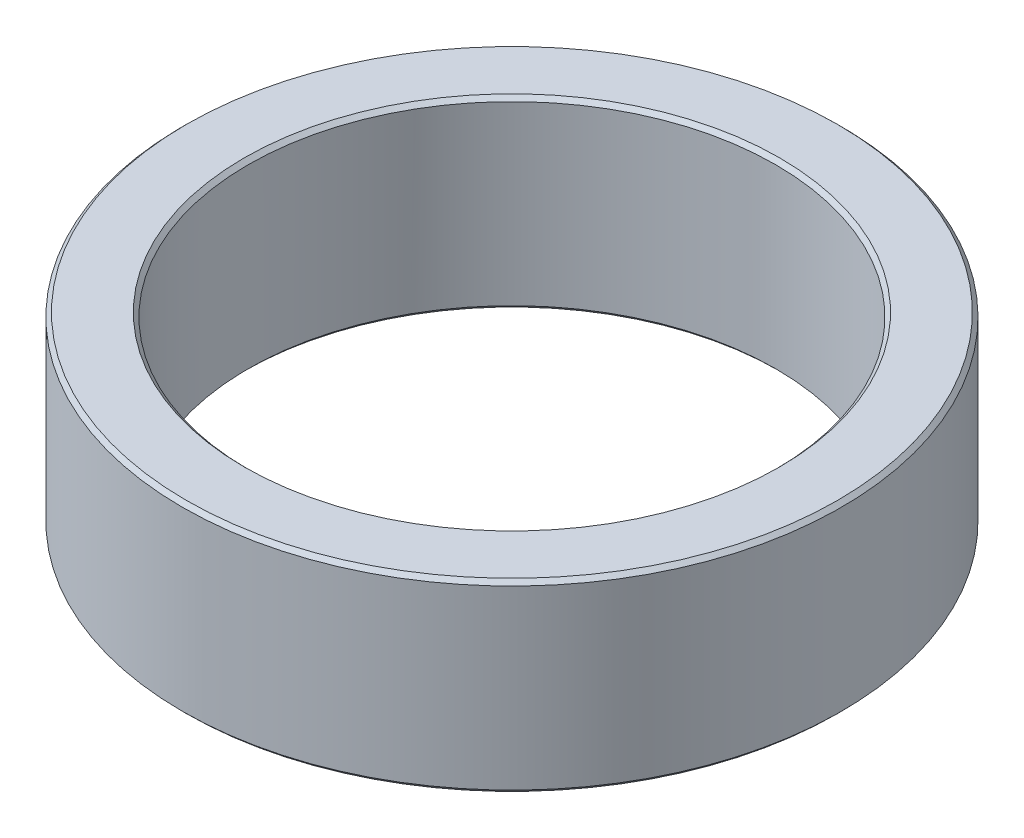
ISO-10303-21;
HEADER;
FILE_DESCRIPTION(('STEP AP214'),'2;1');
FILE_NAME('part.step','',(''),(''),'','','');
FILE_SCHEMA(('AUTOMOTIVE_DESIGN { 1 0 10303 214 1 1 1 1 }'));
ENDSEC;
DATA;
#1=APPLICATION_CONTEXT('core data for automotive mechanical design processes');
#2=APPLICATION_PROTOCOL_DEFINITION('international standard','automotive_design',2000,#1);
#3=PRODUCT_CONTEXT('',#1,'mechanical');
#4=PRODUCT('Part','Part','',(#3));
#5=PRODUCT_RELATED_PRODUCT_CATEGORY('part','',(#4));
#6=PRODUCT_DEFINITION_FORMATION('','',#4);
#7=PRODUCT_DEFINITION_CONTEXT('part definition',#1,'design');
#8=PRODUCT_DEFINITION('design','',#6,#7);
#9=PRODUCT_DEFINITION_SHAPE('','',#8);
#10=(LENGTH_UNIT() NAMED_UNIT(*) SI_UNIT(.MILLI.,.METRE.));
#11=(NAMED_UNIT(*) PLANE_ANGLE_UNIT() SI_UNIT($,.RADIAN.));
#12=(NAMED_UNIT(*) SI_UNIT($,.STERADIAN.) SOLID_ANGLE_UNIT());
#13=UNCERTAINTY_MEASURE_WITH_UNIT(LENGTH_MEASURE(1.E-05),#10,'distance_accuracy_value','');
#14=(GEOMETRIC_REPRESENTATION_CONTEXT(3) GLOBAL_UNCERTAINTY_ASSIGNED_CONTEXT((#13)) GLOBAL_UNIT_ASSIGNED_CONTEXT((#10,
#11,#12)) REPRESENTATION_CONTEXT('',''));
#15=CARTESIAN_POINT('',(0.,0.,0.));
#16=DIRECTION('',(0.,0.,1.));
#17=DIRECTION('',(1.,0.,0.));
#18=AXIS2_PLACEMENT_3D('',#15,#16,#17);
#19=CARTESIAN_POINT('',(0.,7.,0.));
#20=DIRECTION('',(0.,1.,0.));
#21=DIRECTION('',(0.,0.,1.));
#22=AXIS2_PLACEMENT_3D('',#19,#20,#21);
#23=PLANE('',#22);
#24=CARTESIAN_POINT('',(0.,7.,0.));
#25=DIRECTION('',(0.,1.,0.));
#26=DIRECTION('',(0.,0.,1.));
#27=AXIS2_PLACEMENT_3D('',#24,#25,#26);
#28=CIRCLE('',#27,10.15);
#29=CARTESIAN_POINT('',(0.,7.,10.15));
#30=VERTEX_POINT('',#29);
#31=EDGE_CURVE('E10',#30,#30,#28,.F.);
#32=ORIENTED_EDGE('',*,*,#31,.T.);
#33=EDGE_LOOP('',(#32));
#34=FACE_BOUND('',#33,.T.);
#35=CARTESIAN_POINT('',(0.,7.,0.));
#36=DIRECTION('',(0.,1.,0.));
#37=DIRECTION('',(0.,0.,1.));
#38=AXIS2_PLACEMENT_3D('',#35,#36,#37);
#39=CIRCLE('',#38,12.345);
#40=CARTESIAN_POINT('',(0.,7.,12.345));
#41=VERTEX_POINT('',#40);
#42=EDGE_CURVE('E41',#41,#41,#39,.T.);
#43=ORIENTED_EDGE('',*,*,#42,.T.);
#44=EDGE_LOOP('',(#43));
#45=FACE_BOUND('',#44,.T.);
#46=ADVANCED_FACE('F33',(#34,#45),#23,.T.);
#47=CARTESIAN_POINT('',(0.,0.,0.));
#48=DIRECTION('',(0.,1.,0.));
#49=DIRECTION('',(0.,0.,1.));
#50=AXIS2_PLACEMENT_3D('',#47,#48,#49);
#51=PLANE('',#50);
#52=CARTESIAN_POINT('',(0.,0.,0.));
#53=DIRECTION('',(0.,1.,0.));
#54=DIRECTION('',(0.,0.,1.));
#55=AXIS2_PLACEMENT_3D('',#52,#53,#54);
#56=CIRCLE('',#55,10.15);
#57=CARTESIAN_POINT('',(0.,0.,-10.15));
#58=VERTEX_POINT('',#57);
#59=EDGE_CURVE('E60',#58,#58,#56,.T.);
#60=ORIENTED_EDGE('',*,*,#59,.T.);
#61=EDGE_LOOP('',(#60));
#62=FACE_BOUND('',#61,.T.);
#63=CARTESIAN_POINT('',(0.,0.,0.));
#64=DIRECTION('',(0.,1.,0.));
#65=DIRECTION('',(0.,0.,1.));
#66=AXIS2_PLACEMENT_3D('',#63,#64,#65);
#67=CIRCLE('',#66,12.345);
#68=CARTESIAN_POINT('',(0.,0.,12.345));
#69=VERTEX_POINT('',#68);
#70=EDGE_CURVE('E63',#69,#69,#67,.F.);
#71=ORIENTED_EDGE('',*,*,#70,.T.);
#72=EDGE_LOOP('',(#71));
#73=FACE_BOUND('',#72,.T.);
#74=ADVANCED_FACE('F67',(#62,#73),#51,.F.);
#75=CARTESIAN_POINT('',(0.,7.,0.));
#76=DIRECTION('',(0.,-1.,0.));
#77=DIRECTION('',(0.,0.,-1.));
#78=AXIS2_PLACEMENT_3D('',#75,#76,#77);
#79=CYLINDRICAL_SURFACE('',#78,12.495);
#80=CARTESIAN_POINT('',(0.,0.150000000000003,0.));
#81=DIRECTION('',(0.,1.,0.));
#82=DIRECTION('',(0.,0.,1.));
#83=AXIS2_PLACEMENT_3D('',#80,#81,#82);
#84=CIRCLE('',#83,12.495);
#85=CARTESIAN_POINT('',(0.,0.150000000000003,12.495));
#86=VERTEX_POINT('',#85);
#87=EDGE_CURVE('E45',#86,#86,#84,.T.);
#88=ORIENTED_EDGE('',*,*,#87,.T.);
#89=EDGE_LOOP('',(#88));
#90=FACE_BOUND('',#89,.T.);
#91=CARTESIAN_POINT('',(0.,6.85000000000001,0.));
#92=DIRECTION('',(0.,1.,0.));
#93=DIRECTION('',(0.,0.,1.));
#94=AXIS2_PLACEMENT_3D('',#91,#92,#93);
#95=CIRCLE('',#94,12.495);
#96=CARTESIAN_POINT('',(0.,6.85000000000001,12.495));
#97=VERTEX_POINT('',#96);
#98=EDGE_CURVE('E49',#97,#97,#95,.F.);
#99=ORIENTED_EDGE('',*,*,#98,.T.);
#100=EDGE_LOOP('',(#99));
#101=FACE_BOUND('',#100,.T.);
#102=ADVANCED_FACE('F77',(#90,#101),#79,.T.);
#103=CARTESIAN_POINT('',(0.,7.,0.));
#104=DIRECTION('',(0.,-1.,0.));
#105=DIRECTION('',(0.,0.,-1.));
#106=AXIS2_PLACEMENT_3D('',#103,#104,#105);
#107=CYLINDRICAL_SURFACE('',#106,10.);
#108=CARTESIAN_POINT('',(0.,0.150000000000003,0.));
#109=DIRECTION('',(0.,1.,0.));
#110=DIRECTION('',(0.,0.,1.));
#111=AXIS2_PLACEMENT_3D('',#108,#109,#110);
#112=CIRCLE('',#111,10.);
#113=CARTESIAN_POINT('',(0.,0.150000000000003,-10.));
#114=VERTEX_POINT('',#113);
#115=EDGE_CURVE('E54',#114,#114,#112,.F.);
#116=ORIENTED_EDGE('',*,*,#115,.T.);
#117=EDGE_LOOP('',(#116));
#118=FACE_BOUND('',#117,.T.);
#119=CARTESIAN_POINT('',(0.,6.85,0.));
#120=DIRECTION('',(0.,1.,0.));
#121=DIRECTION('',(0.,0.,1.));
#122=AXIS2_PLACEMENT_3D('',#119,#120,#121);
#123=CIRCLE('',#122,10.);
#124=CARTESIAN_POINT('',(0.,6.85,10.));
#125=VERTEX_POINT('',#124);
#126=EDGE_CURVE('E57',#125,#125,#123,.T.);
#127=ORIENTED_EDGE('',*,*,#126,.T.);
#128=EDGE_LOOP('',(#127));
#129=FACE_BOUND('',#128,.T.);
#130=ADVANCED_FACE('F80',(#118,#129),#107,.F.);
#131=CARTESIAN_POINT('',(0.,0.,0.));
#132=DIRECTION('',(0.,-1.,0.));
#133=DIRECTION('',(0.,0.,-1.));
#134=AXIS2_PLACEMENT_3D('',#131,#132,#133);
#135=CONICAL_SURFACE('',#134,10.15,0.785398163397443);
#136=CARTESIAN_POINT('',(0.,0.150000000000003,-10.));
#137=CARTESIAN_POINT('',(0.,0.148437500000002,-10.0015625));
#138=CARTESIAN_POINT('',(0.,0.146875000000002,-10.003125));
#139=CARTESIAN_POINT('',(0.,0.143750000000002,-10.00625));
#140=CARTESIAN_POINT('',(0.,0.142187500000003,-10.0078125));
#141=CARTESIAN_POINT('',(0.,0.139062500000003,-10.0109375));
#142=CARTESIAN_POINT('',(0.,0.137500000000002,-10.0125));
#143=CARTESIAN_POINT('',(0.,0.134375000000002,-10.015625));
#144=CARTESIAN_POINT('',(0.,0.132812500000002,-10.0171875));
#145=CARTESIAN_POINT('',(0.,0.129687500000002,-10.0203125));
#146=CARTESIAN_POINT('',(0.,0.128125000000002,-10.021875));
#147=CARTESIAN_POINT('',(0.,0.125000000000002,-10.025));
#148=CARTESIAN_POINT('',(0.,0.123437500000002,-10.0265625));
#149=CARTESIAN_POINT('',(0.,0.120312500000002,-10.0296875));
#150=CARTESIAN_POINT('',(0.,0.118750000000002,-10.03125));
#151=CARTESIAN_POINT('',(0.,0.115625000000002,-10.034375));
#152=CARTESIAN_POINT('',(0.,0.114062500000002,-10.0359375));
#153=CARTESIAN_POINT('',(0.,0.110937500000002,-10.0390625));
#154=CARTESIAN_POINT('',(0.,0.109375000000002,-10.040625));
#155=CARTESIAN_POINT('',(0.,0.106250000000002,-10.04375));
#156=CARTESIAN_POINT('',(0.,0.104687500000002,-10.0453125));
#157=CARTESIAN_POINT('',(0.,0.101562500000002,-10.0484375));
#158=CARTESIAN_POINT('',(0.,0.100000000000002,-10.05));
#159=CARTESIAN_POINT('',(0.,0.0968750000000015,-10.053125));
#160=CARTESIAN_POINT('',(0.,0.0953125000000017,-10.0546875));
#161=CARTESIAN_POINT('',(0.,0.0921875000000018,-10.0578125));
#162=CARTESIAN_POINT('',(0.,0.0906250000000016,-10.059375));
#163=CARTESIAN_POINT('',(0.,0.0875000000000014,-10.0625));
#164=CARTESIAN_POINT('',(0.,0.0859375000000012,-10.0640625));
#165=CARTESIAN_POINT('',(0.,0.0828125000000013,-10.0671875));
#166=CARTESIAN_POINT('',(0.,0.0812500000000015,-10.06875));
#167=CARTESIAN_POINT('',(0.,0.0781250000000015,-10.071875));
#168=CARTESIAN_POINT('',(0.,0.0765625000000014,-10.0734375));
#169=CARTESIAN_POINT('',(0.,0.0734375000000011,-10.0765625));
#170=CARTESIAN_POINT('',(0.,0.071875000000001,-10.078125));
#171=CARTESIAN_POINT('',(0.,0.0687500000000011,-10.08125));
#172=CARTESIAN_POINT('',(0.,0.0671875000000012,-10.0828125));
#173=CARTESIAN_POINT('',(0.,0.0640625000000013,-10.0859375));
#174=CARTESIAN_POINT('',(0.,0.0625000000000012,-10.0875));
#175=CARTESIAN_POINT('',(0.,0.0593750000000009,-10.090625));
#176=CARTESIAN_POINT('',(0.,0.0578125000000008,-10.0921875));
#177=CARTESIAN_POINT('',(0.,0.0546875000000008,-10.0953125));
#178=CARTESIAN_POINT('',(0.,0.053125000000001,-10.096875));
#179=CARTESIAN_POINT('',(0.,0.050000000000001,-10.1));
#180=CARTESIAN_POINT('',(0.,0.0484375000000009,-10.1015625));
#181=CARTESIAN_POINT('',(0.,0.0453125000000007,-10.1046875));
#182=CARTESIAN_POINT('',(0.,0.0437500000000005,-10.10625));
#183=CARTESIAN_POINT('',(0.,0.0406250000000006,-10.109375));
#184=CARTESIAN_POINT('',(0.,0.0390625000000008,-10.1109375));
#185=CARTESIAN_POINT('',(0.,0.0359375000000008,-10.1140625));
#186=CARTESIAN_POINT('',(0.,0.0343750000000006,-10.115625));
#187=CARTESIAN_POINT('',(0.,0.0312500000000005,-10.11875));
#188=CARTESIAN_POINT('',(0.,0.0296875000000005,-10.1203125));
#189=CARTESIAN_POINT('',(0.,0.0265625000000004,-10.1234375));
#190=CARTESIAN_POINT('',(0.,0.0250000000000002,-10.125));
#191=CARTESIAN_POINT('',(0.,0.0218750000000003,-10.128125));
#192=CARTESIAN_POINT('',(0.,0.0203125000000004,-10.1296875));
#193=CARTESIAN_POINT('',(0.,0.0171875000000005,-10.1328125));
#194=CARTESIAN_POINT('',(0.,0.0156250000000004,-10.134375));
#195=CARTESIAN_POINT('',(0.,0.0125000000000001,-10.1375));
#196=CARTESIAN_POINT('',(0.,0.0109375,-10.1390625));
#197=CARTESIAN_POINT('',(0.,0.00781250000000001,-10.1421875));
#198=CARTESIAN_POINT('',(0.,0.00625000000000012,-10.14375));
#199=CARTESIAN_POINT('',(0.,0.00312500000000033,-10.146875));
#200=CARTESIAN_POINT('',(0.,0.00156250000000044,-10.1484375));
#201=CARTESIAN_POINT('',(0.,0.,-10.15));
#202=B_SPLINE_CURVE_WITH_KNOTS('',3,(#136,#137,#138,#139,#140,#141,#142,#143,#144,#145,#146,
#147,#148,#149,#150,#151,#152,#153,#154,#155,#156,#157,#158,#159,#160,#161,#162,#163,#164,#165,
#166,#167,#168,#169,#170,#171,#172,#173,#174,#175,#176,#177,#178,#179,#180,#181,#182,#183,#184,
#185,#186,#187,#188,#189,#190,#191,#192,#193,#194,#195,#196,#197,#198,#199,#200,#201),
.UNSPECIFIED.,.F.,.F.,(4,2,2,2,2,2,2,2,2,2,2,2,2,2,2,2,2,2,2,2,2,2,2,2,2,2,2,2,2,2,2,2,4),(0.,
0.00662912607362357,0.0132582521472484,0.0198873782208719,0.0265165042944955,0.0331456303681203,
0.0397747564417439,0.0464038825153675,0.0530330085889923,0.0596621346626158,0.0662912607362394,
0.072920386809863,0.0795495128834878,0.0861786389571114,0.092807765030735,0.0994368911043598,
0.106066017177983,0.112695143251607,0.119324269325232,0.125953395398855,0.132582521472479,
0.139211647546104,0.145840773619727,0.152469899693351,0.159099025766976,0.165728151840599,
0.172357277914223,0.178986403987846,0.185615530061471,0.192244656135095,0.198873782208718,
0.205502908282343,0.212132034355967),.UNSPECIFIED.);
#203=EDGE_CURVE('BSEAM73',#114,#58,#202,.T.);
#204=ORIENTED_EDGE('',*,*,#115,.F.);
#205=ORIENTED_EDGE('',*,*,#59,.F.);
#206=ORIENTED_EDGE('',*,*,#203,.T.);
#207=ORIENTED_EDGE('',*,*,#203,.F.);
#208=EDGE_LOOP('',(#204,#206,#205,#207));
#209=FACE_BOUND('',#208,.T.);
#210=ADVANCED_FACE('F73',(#209),#135,.F.);
#211=CARTESIAN_POINT('',(0.,0.150000000000003,0.));
#212=DIRECTION('',(0.,1.,0.));
#213=DIRECTION('',(0.,0.,1.));
#214=AXIS2_PLACEMENT_3D('',#211,#212,#213);
#215=CONICAL_SURFACE('',#214,12.495,0.785398163397454);
#216=CARTESIAN_POINT('',(0.,0.,12.345));
#217=CARTESIAN_POINT('',(0.,0.0015625000000004,12.3465625));
#218=CARTESIAN_POINT('',(0.,0.0031250000000003,12.348125));
#219=CARTESIAN_POINT('',(0.,0.00625000000000009,12.35125));
#220=CARTESIAN_POINT('',(0.,0.00781249999999999,12.3528125));
#221=CARTESIAN_POINT('',(0.,0.0109375,12.3559375));
#222=CARTESIAN_POINT('',(0.,0.0125000000000001,12.3575));
#223=CARTESIAN_POINT('',(0.,0.0156250000000003,12.360625));
#224=CARTESIAN_POINT('',(0.,0.0171875000000005,12.3621875));
#225=CARTESIAN_POINT('',(0.,0.0203125000000004,12.3653125));
#226=CARTESIAN_POINT('',(0.,0.0218750000000002,12.366875));
#227=CARTESIAN_POINT('',(0.,0.0250000000000003,12.37));
#228=CARTESIAN_POINT('',(0.,0.0265625000000005,12.3715625));
#229=CARTESIAN_POINT('',(0.,0.0296875000000006,12.3746875));
#230=CARTESIAN_POINT('',(0.,0.0312500000000004,12.37625));
#231=CARTESIAN_POINT('',(0.,0.0343750000000003,12.379375));
#232=CARTESIAN_POINT('',(0.,0.0359375000000005,12.3809375));
#233=CARTESIAN_POINT('',(0.,0.0390625000000007,12.3840625));
#234=CARTESIAN_POINT('',(0.,0.0406250000000008,12.385625));
#235=CARTESIAN_POINT('',(0.,0.0437500000000008,12.38875));
#236=CARTESIAN_POINT('',(0.,0.0453125000000006,12.3903125));
#237=CARTESIAN_POINT('',(0.,0.0484375000000006,12.3934375));
#238=CARTESIAN_POINT('',(0.,0.0500000000000007,12.395));
#239=CARTESIAN_POINT('',(0.,0.053125000000001,12.398125));
#240=CARTESIAN_POINT('',(0.,0.0546875000000011,12.3996875));
#241=CARTESIAN_POINT('',(0.,0.057812500000001,12.4028125));
#242=CARTESIAN_POINT('',(0.,0.0593750000000008,12.404375));
#243=CARTESIAN_POINT('',(0.,0.0625000000000009,12.4075));
#244=CARTESIAN_POINT('',(0.,0.0640625000000012,12.4090625));
#245=CARTESIAN_POINT('',(0.,0.0671875000000013,12.4121875));
#246=CARTESIAN_POINT('',(0.,0.0687500000000011,12.41375));
#247=CARTESIAN_POINT('',(0.,0.071875000000001,12.416875));
#248=CARTESIAN_POINT('',(0.,0.0734375000000011,12.4184375));
#249=CARTESIAN_POINT('',(0.,0.0765625000000014,12.4215625));
#250=CARTESIAN_POINT('',(0.,0.0781250000000015,12.423125));
#251=CARTESIAN_POINT('',(0.,0.0812500000000015,12.42625));
#252=CARTESIAN_POINT('',(0.,0.0828125000000013,12.4278125));
#253=CARTESIAN_POINT('',(0.,0.0859375000000012,12.4309375));
#254=CARTESIAN_POINT('',(0.,0.0875000000000014,12.4325));
#255=CARTESIAN_POINT('',(0.,0.0906250000000016,12.435625));
#256=CARTESIAN_POINT('',(0.,0.0921875000000018,12.4371875));
#257=CARTESIAN_POINT('',(0.,0.0953125000000017,12.4403125));
#258=CARTESIAN_POINT('',(0.,0.0968750000000015,12.441875));
#259=CARTESIAN_POINT('',(0.,0.100000000000002,12.445));
#260=CARTESIAN_POINT('',(0.,0.101562500000002,12.4465625));
#261=CARTESIAN_POINT('',(0.,0.104687500000002,12.4496875));
#262=CARTESIAN_POINT('',(0.,0.106250000000002,12.45125));
#263=CARTESIAN_POINT('',(0.,0.109375000000002,12.454375));
#264=CARTESIAN_POINT('',(0.,0.110937500000002,12.4559375));
#265=CARTESIAN_POINT('',(0.,0.114062500000002,12.4590625));
#266=CARTESIAN_POINT('',(0.,0.115625000000002,12.460625));
#267=CARTESIAN_POINT('',(0.,0.118750000000002,12.46375));
#268=CARTESIAN_POINT('',(0.,0.120312500000002,12.4653125));
#269=CARTESIAN_POINT('',(0.,0.123437500000002,12.4684375));
#270=CARTESIAN_POINT('',(0.,0.125000000000002,12.47));
#271=CARTESIAN_POINT('',(0.,0.128125000000002,12.473125));
#272=CARTESIAN_POINT('',(0.,0.129687500000002,12.4746875));
#273=CARTESIAN_POINT('',(0.,0.132812500000002,12.4778125));
#274=CARTESIAN_POINT('',(0.,0.134375000000002,12.479375));
#275=CARTESIAN_POINT('',(0.,0.137500000000002,12.4825));
#276=CARTESIAN_POINT('',(0.,0.139062500000002,12.4840625));
#277=CARTESIAN_POINT('',(0.,0.142187500000003,12.4871875));
#278=CARTESIAN_POINT('',(0.,0.143750000000002,12.48875));
#279=CARTESIAN_POINT('',(0.,0.146875000000002,12.491875));
#280=CARTESIAN_POINT('',(0.,0.148437500000002,12.4934375));
#281=CARTESIAN_POINT('',(0.,0.150000000000003,12.495));
#282=B_SPLINE_CURVE_WITH_KNOTS('',3,(#216,#217,#218,#219,#220,#221,#222,#223,#224,#225,#226,
#227,#228,#229,#230,#231,#232,#233,#234,#235,#236,#237,#238,#239,#240,#241,#242,#243,#244,#245,
#246,#247,#248,#249,#250,#251,#252,#253,#254,#255,#256,#257,#258,#259,#260,#261,#262,#263,#264,
#265,#266,#267,#268,#269,#270,#271,#272,#273,#274,#275,#276,#277,#278,#279,#280,#281),
.UNSPECIFIED.,.F.,.F.,(4,2,2,2,2,2,2,2,2,2,2,2,2,2,2,2,2,2,2,2,2,2,2,2,2,2,2,2,2,2,2,2,4),(0.,
0.00662912607362357,0.0132582521472484,0.0198873782208719,0.0265165042944955,0.0331456303681203,
0.0397747564417439,0.0464038825153687,0.0530330085889923,0.0596621346626158,0.0662912607362406,
0.0729203868098642,0.0795495128834878,0.0861786389571126,0.0928077650307362,0.099436891104361,
0.106066017177985,0.112695143251608,0.119324269325233,0.125953395398857,0.13258252147248,
0.139211647546105,0.145840773619728,0.152469899693353,0.159099025766977,0.1657281518406,
0.172357277914225,0.178986403987849,0.185615530061472,0.192244656135097,0.198873782208721,
0.205502908282346,0.212132034355969),.UNSPECIFIED.);
#283=EDGE_CURVE('BSEAM69',#69,#86,#282,.T.);
#284=ORIENTED_EDGE('',*,*,#70,.F.);
#285=ORIENTED_EDGE('',*,*,#87,.F.);
#286=ORIENTED_EDGE('',*,*,#283,.T.);
#287=ORIENTED_EDGE('',*,*,#283,.F.);
#288=EDGE_LOOP('',(#284,#286,#285,#287));
#289=FACE_BOUND('',#288,.T.);
#290=ADVANCED_FACE('F69',(#289),#215,.T.);
#291=CARTESIAN_POINT('',(0.,6.85,0.));
#292=DIRECTION('',(0.,1.,0.));
#293=DIRECTION('',(0.,0.,1.));
#294=AXIS2_PLACEMENT_3D('',#291,#292,#293);
#295=CONICAL_SURFACE('',#294,10.,0.785398163397454);
#296=ORIENTED_EDGE('',*,*,#31,.F.);
#297=EDGE_LOOP('',(#296));
#298=FACE_BOUND('',#297,.T.);
#299=ORIENTED_EDGE('',*,*,#126,.F.);
#300=EDGE_LOOP('',(#299));
#301=FACE_BOUND('',#300,.T.);
#302=ADVANCED_FACE('F72',(#298,#301),#295,.F.);
#303=CARTESIAN_POINT('',(0.,7.,0.));
#304=DIRECTION('',(0.,-1.,0.));
#305=DIRECTION('',(0.,0.,-1.));
#306=AXIS2_PLACEMENT_3D('',#303,#304,#305);
#307=CONICAL_SURFACE('',#306,12.345,0.785398163397466);
#308=ORIENTED_EDGE('',*,*,#98,.F.);
#309=EDGE_LOOP('',(#308));
#310=FACE_BOUND('',#309,.T.);
#311=ORIENTED_EDGE('',*,*,#42,.F.);
#312=EDGE_LOOP('',(#311));
#313=FACE_BOUND('',#312,.T.);
#314=ADVANCED_FACE('F36',(#310,#313),#307,.T.);
#315=CLOSED_SHELL('',(#46,#74,#102,#130,#210,#290,#302,#314));
#316=MANIFOLD_SOLID_BREP('B2',#315);
#317=ADVANCED_BREP_SHAPE_REPRESENTATION('',(#18,#316),#14);
#318=SHAPE_DEFINITION_REPRESENTATION(#9,#317);
ENDSEC;
END-ISO-10303-21;
